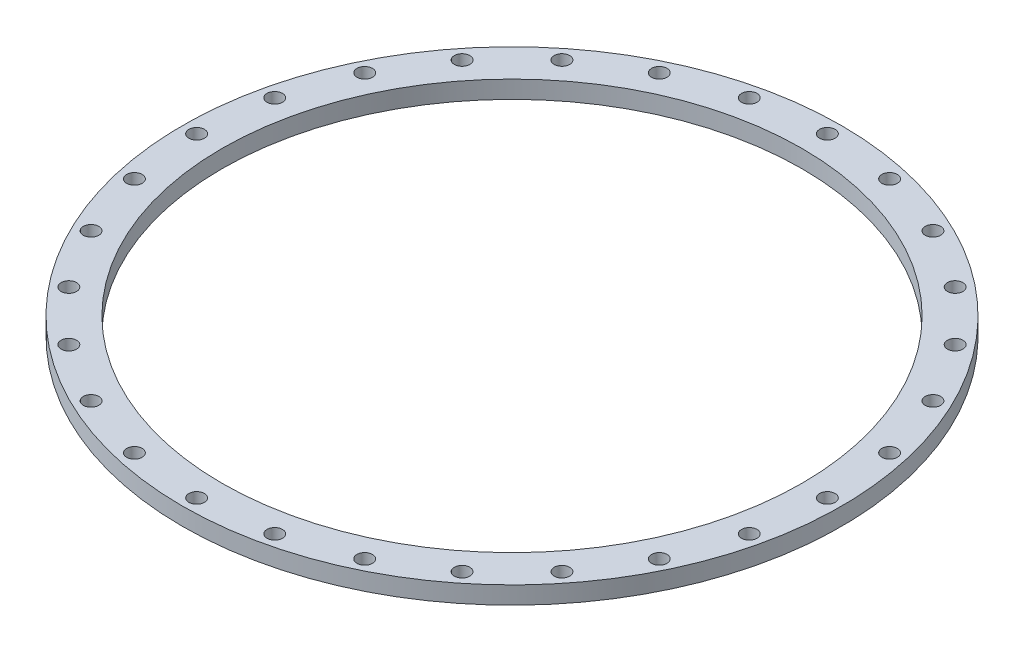
ISO-10303-21;
HEADER;
FILE_DESCRIPTION(('STEP AP214'),'2;1');
FILE_NAME('part.step','',(''),(''),'','','');
FILE_SCHEMA(('AUTOMOTIVE_DESIGN { 1 0 10303 214 1 1 1 1 }'));
ENDSEC;
DATA;
#1=APPLICATION_CONTEXT('core data for automotive mechanical design processes');
#2=APPLICATION_PROTOCOL_DEFINITION('international standard','automotive_design',2000,#1);
#3=PRODUCT_CONTEXT('',#1,'mechanical');
#4=PRODUCT('Part','Part','',(#3));
#5=PRODUCT_RELATED_PRODUCT_CATEGORY('part','',(#4));
#6=PRODUCT_DEFINITION_FORMATION('','',#4);
#7=PRODUCT_DEFINITION_CONTEXT('part definition',#1,'design');
#8=PRODUCT_DEFINITION('design','',#6,#7);
#9=PRODUCT_DEFINITION_SHAPE('','',#8);
#10=(LENGTH_UNIT() NAMED_UNIT(*) SI_UNIT(.MILLI.,.METRE.));
#11=(NAMED_UNIT(*) PLANE_ANGLE_UNIT() SI_UNIT($,.RADIAN.));
#12=(NAMED_UNIT(*) SI_UNIT($,.STERADIAN.) SOLID_ANGLE_UNIT());
#13=UNCERTAINTY_MEASURE_WITH_UNIT(LENGTH_MEASURE(1.E-05),#10,'distance_accuracy_value','');
#14=(GEOMETRIC_REPRESENTATION_CONTEXT(3) GLOBAL_UNCERTAINTY_ASSIGNED_CONTEXT((#13)) GLOBAL_UNIT_ASSIGNED_CONTEXT((#10,
#11,#12)) REPRESENTATION_CONTEXT('',''));
#15=CARTESIAN_POINT('',(0.,0.,0.));
#16=DIRECTION('',(0.,0.,1.));
#17=DIRECTION('',(1.,0.,0.));
#18=AXIS2_PLACEMENT_3D('',#15,#16,#17);
#19=CARTESIAN_POINT('',(0.,-34.,0.));
#20=DIRECTION('',(0.,1.,0.));
#21=DIRECTION('',(0.,0.,1.));
#22=AXIS2_PLACEMENT_3D('',#19,#20,#21);
#23=CYLINDRICAL_SURFACE('',#22,637.5);
#24=CARTESIAN_POINT('',(0.,-34.,0.));
#25=DIRECTION('',(0.,1.,0.));
#26=DIRECTION('',(0.,0.,1.));
#27=AXIS2_PLACEMENT_3D('',#24,#25,#26);
#28=CIRCLE('',#27,637.5);
#29=CARTESIAN_POINT('',(0.,-34.,637.5));
#30=VERTEX_POINT('',#29);
#31=EDGE_CURVE('E10',#30,#30,#28,.T.);
#32=ORIENTED_EDGE('',*,*,#31,.T.);
#33=EDGE_LOOP('',(#32));
#34=FACE_BOUND('',#33,.T.);
#35=CARTESIAN_POINT('',(0.,0.,0.));
#36=DIRECTION('',(0.,1.,0.));
#37=DIRECTION('',(0.,0.,1.));
#38=AXIS2_PLACEMENT_3D('',#35,#36,#37);
#39=CIRCLE('',#38,637.5);
#40=CARTESIAN_POINT('',(0.,0.,637.5));
#41=VERTEX_POINT('',#40);
#42=EDGE_CURVE('E35',#41,#41,#39,.T.);
#43=ORIENTED_EDGE('',*,*,#42,.F.);
#44=EDGE_LOOP('',(#43));
#45=FACE_BOUND('',#44,.T.);
#46=ADVANCED_FACE('F32',(#34,#45),#23,.T.);
#47=CARTESIAN_POINT('',(0.,-34.,0.));
#48=DIRECTION('',(0.,1.,0.));
#49=DIRECTION('',(0.,0.,1.));
#50=AXIS2_PLACEMENT_3D('',#47,#48,#49);
#51=PLANE('',#50);
#52=CARTESIAN_POINT('',(-135.737769713352,-34.,-594.706026430912));
#53=DIRECTION('',(0.,1.,0.));
#54=DIRECTION('',(0.,0.,1.));
#55=AXIS2_PLACEMENT_3D('',#52,#53,#54);
#56=CIRCLE('',#55,15.);
#57=CARTESIAN_POINT('',(-135.737769713352,-34.,-579.706026430912));
#58=VERTEX_POINT('',#57);
#59=EDGE_CURVE('E209',#58,#58,#56,.T.);
#60=ORIENTED_EDGE('',*,*,#59,.T.);
#61=EDGE_LOOP('',(#60));
#62=FACE_BOUND('',#61,.T.);
#63=CARTESIAN_POINT('',(-264.66908086171,-34.,-549.591009420475));
#64=DIRECTION('',(0.,1.,0.));
#65=DIRECTION('',(0.,0.,1.));
#66=AXIS2_PLACEMENT_3D('',#63,#64,#65);
#67=CIRCLE('',#66,15.);
#68=CARTESIAN_POINT('',(-264.66908086171,-34.,-534.591009420475));
#69=VERTEX_POINT('',#68);
#70=EDGE_CURVE('E203',#69,#69,#67,.T.);
#71=ORIENTED_EDGE('',*,*,#70,.T.);
#72=EDGE_LOOP('',(#71));
#73=FACE_BOUND('',#72,.T.);
#74=CARTESIAN_POINT('',(-380.328779133827,-34.,-476.917204305498));
#75=DIRECTION('',(0.,1.,0.));
#76=DIRECTION('',(0.,0.,1.));
#77=AXIS2_PLACEMENT_3D('',#74,#75,#76);
#78=CIRCLE('',#77,15.);
#79=CARTESIAN_POINT('',(-380.328779133827,-34.,-461.917204305498));
#80=VERTEX_POINT('',#79);
#81=EDGE_CURVE('E197',#80,#80,#78,.T.);
#82=ORIENTED_EDGE('',*,*,#81,.T.);
#83=EDGE_LOOP('',(#82));
#84=FACE_BOUND('',#83,.T.);
#85=CARTESIAN_POINT('',(-476.917204305498,-34.,-380.328779133827));
#86=DIRECTION('',(0.,1.,0.));
#87=DIRECTION('',(0.,0.,1.));
#88=AXIS2_PLACEMENT_3D('',#85,#86,#87);
#89=CIRCLE('',#88,15.);
#90=CARTESIAN_POINT('',(-476.917204305498,-34.,-365.328779133827));
#91=VERTEX_POINT('',#90);
#92=EDGE_CURVE('E191',#91,#91,#89,.T.);
#93=ORIENTED_EDGE('',*,*,#92,.T.);
#94=EDGE_LOOP('',(#93));
#95=FACE_BOUND('',#94,.T.);
#96=CARTESIAN_POINT('',(-549.591009420475,-34.,-264.66908086171));
#97=DIRECTION('',(0.,1.,0.));
#98=DIRECTION('',(0.,0.,1.));
#99=AXIS2_PLACEMENT_3D('',#96,#97,#98);
#100=CIRCLE('',#99,15.);
#101=CARTESIAN_POINT('',(-549.591009420475,-34.,-249.66908086171));
#102=VERTEX_POINT('',#101);
#103=EDGE_CURVE('E185',#102,#102,#100,.T.);
#104=ORIENTED_EDGE('',*,*,#103,.T.);
#105=EDGE_LOOP('',(#104));
#106=FACE_BOUND('',#105,.T.);
#107=CARTESIAN_POINT('',(-594.706026430912,-34.,-135.737769713351));
#108=DIRECTION('',(0.,1.,0.));
#109=DIRECTION('',(0.,0.,1.));
#110=AXIS2_PLACEMENT_3D('',#107,#108,#109);
#111=CIRCLE('',#110,15.);
#112=CARTESIAN_POINT('',(-594.706026430912,-34.,-120.737769713351));
#113=VERTEX_POINT('',#112);
#114=EDGE_CURVE('E179',#113,#113,#111,.T.);
#115=ORIENTED_EDGE('',*,*,#114,.T.);
#116=EDGE_LOOP('',(#115));
#117=FACE_BOUND('',#116,.T.);
#118=CARTESIAN_POINT('',(-609.999999999999,-34.,7.07767178198537E-13));
#119=DIRECTION('',(0.,1.,0.));
#120=DIRECTION('',(0.,0.,1.));
#121=AXIS2_PLACEMENT_3D('',#118,#119,#120);
#122=CIRCLE('',#121,15.);
#123=CARTESIAN_POINT('',(-609.999999999999,-34.,15.0000000000007));
#124=VERTEX_POINT('',#123);
#125=EDGE_CURVE('E173',#124,#124,#122,.T.);
#126=ORIENTED_EDGE('',*,*,#125,.T.);
#127=EDGE_LOOP('',(#126));
#128=FACE_BOUND('',#127,.T.);
#129=CARTESIAN_POINT('',(-594.706026430911,-34.,135.737769713352));
#130=DIRECTION('',(0.,1.,0.));
#131=DIRECTION('',(0.,0.,1.));
#132=AXIS2_PLACEMENT_3D('',#129,#130,#131);
#133=CIRCLE('',#132,15.);
#134=CARTESIAN_POINT('',(-594.706026430911,-34.,150.737769713352));
#135=VERTEX_POINT('',#134);
#136=EDGE_CURVE('E167',#135,#135,#133,.T.);
#137=ORIENTED_EDGE('',*,*,#136,.T.);
#138=EDGE_LOOP('',(#137));
#139=FACE_BOUND('',#138,.T.);
#140=CARTESIAN_POINT('',(-549.591009420475,-34.,264.669080861711));
#141=DIRECTION('',(0.,1.,0.));
#142=DIRECTION('',(0.,0.,1.));
#143=AXIS2_PLACEMENT_3D('',#140,#141,#142);
#144=CIRCLE('',#143,15.);
#145=CARTESIAN_POINT('',(-549.591009420475,-34.,279.669080861711));
#146=VERTEX_POINT('',#145);
#147=EDGE_CURVE('E161',#146,#146,#144,.T.);
#148=ORIENTED_EDGE('',*,*,#147,.T.);
#149=EDGE_LOOP('',(#148));
#150=FACE_BOUND('',#149,.T.);
#151=CARTESIAN_POINT('',(-476.917204305497,-34.,380.328779133828));
#152=DIRECTION('',(0.,1.,0.));
#153=DIRECTION('',(0.,0.,1.));
#154=AXIS2_PLACEMENT_3D('',#151,#152,#153);
#155=CIRCLE('',#154,15.);
#156=CARTESIAN_POINT('',(-476.917204305497,-34.,395.328779133828));
#157=VERTEX_POINT('',#156);
#158=EDGE_CURVE('E155',#157,#157,#155,.T.);
#159=ORIENTED_EDGE('',*,*,#158,.T.);
#160=EDGE_LOOP('',(#159));
#161=FACE_BOUND('',#160,.T.);
#162=CARTESIAN_POINT('',(-380.328779133826,-34.,476.917204305499));
#163=DIRECTION('',(0.,1.,0.));
#164=DIRECTION('',(0.,0.,1.));
#165=AXIS2_PLACEMENT_3D('',#162,#163,#164);
#166=CIRCLE('',#165,15.);
#167=CARTESIAN_POINT('',(-380.328779133826,-34.,491.917204305499));
#168=VERTEX_POINT('',#167);
#169=EDGE_CURVE('E149',#168,#168,#166,.T.);
#170=ORIENTED_EDGE('',*,*,#169,.T.);
#171=EDGE_LOOP('',(#170));
#172=FACE_BOUND('',#171,.T.);
#173=CARTESIAN_POINT('',(-264.669080861709,-34.,549.591009420476));
#174=DIRECTION('',(0.,1.,0.));
#175=DIRECTION('',(0.,0.,1.));
#176=AXIS2_PLACEMENT_3D('',#173,#174,#175);
#177=CIRCLE('',#176,15.);
#178=CARTESIAN_POINT('',(-264.669080861709,-34.,564.591009420476));
#179=VERTEX_POINT('',#178);
#180=EDGE_CURVE('E143',#179,#179,#177,.T.);
#181=ORIENTED_EDGE('',*,*,#180,.T.);
#182=EDGE_LOOP('',(#181));
#183=FACE_BOUND('',#182,.T.);
#184=CARTESIAN_POINT('',(-135.73776971335,-34.,594.706026430912));
#185=DIRECTION('',(0.,1.,0.));
#186=DIRECTION('',(0.,0.,1.));
#187=AXIS2_PLACEMENT_3D('',#184,#185,#186);
#188=CIRCLE('',#187,15.);
#189=CARTESIAN_POINT('',(-135.73776971335,-34.,609.706026430912));
#190=VERTEX_POINT('',#189);
#191=EDGE_CURVE('E137',#190,#190,#188,.T.);
#192=ORIENTED_EDGE('',*,*,#191,.T.);
#193=EDGE_LOOP('',(#192));
#194=FACE_BOUND('',#193,.T.);
#195=CARTESIAN_POINT('',(1.4137996329211E-12,-34.,610.));
#196=DIRECTION('',(0.,1.,0.));
#197=DIRECTION('',(0.,0.,1.));
#198=AXIS2_PLACEMENT_3D('',#195,#196,#197);
#199=CIRCLE('',#198,15.);
#200=CARTESIAN_POINT('',(1.4137996329211E-12,-34.,625.));
#201=VERTEX_POINT('',#200);
#202=EDGE_CURVE('E131',#201,#201,#199,.T.);
#203=ORIENTED_EDGE('',*,*,#202,.T.);
#204=EDGE_LOOP('',(#203));
#205=FACE_BOUND('',#204,.T.);
#206=CARTESIAN_POINT('',(135.737769713353,-34.,594.706026430912));
#207=DIRECTION('',(0.,1.,0.));
#208=DIRECTION('',(0.,0.,1.));
#209=AXIS2_PLACEMENT_3D('',#206,#207,#208);
#210=CIRCLE('',#209,15.);
#211=CARTESIAN_POINT('',(135.737769713353,-34.,609.706026430912));
#212=VERTEX_POINT('',#211);
#213=EDGE_CURVE('E125',#212,#212,#210,.T.);
#214=ORIENTED_EDGE('',*,*,#213,.T.);
#215=EDGE_LOOP('',(#214));
#216=FACE_BOUND('',#215,.T.);
#217=CARTESIAN_POINT('',(264.669080861712,-34.,549.591009420475));
#218=DIRECTION('',(0.,1.,0.));
#219=DIRECTION('',(0.,0.,1.));
#220=AXIS2_PLACEMENT_3D('',#217,#218,#219);
#221=CIRCLE('',#220,15.);
#222=CARTESIAN_POINT('',(264.669080861712,-34.,564.591009420475));
#223=VERTEX_POINT('',#222);
#224=EDGE_CURVE('E119',#223,#223,#221,.T.);
#225=ORIENTED_EDGE('',*,*,#224,.T.);
#226=EDGE_LOOP('',(#225));
#227=FACE_BOUND('',#226,.T.);
#228=CARTESIAN_POINT('',(380.328779133829,-34.,476.917204305498));
#229=DIRECTION('',(0.,1.,0.));
#230=DIRECTION('',(0.,0.,1.));
#231=AXIS2_PLACEMENT_3D('',#228,#229,#230);
#232=CIRCLE('',#231,15.);
#233=CARTESIAN_POINT('',(380.328779133829,-34.,491.917204305498));
#234=VERTEX_POINT('',#233);
#235=EDGE_CURVE('E113',#234,#234,#232,.T.);
#236=ORIENTED_EDGE('',*,*,#235,.T.);
#237=EDGE_LOOP('',(#236));
#238=FACE_BOUND('',#237,.T.);
#239=CARTESIAN_POINT('',(476.917204305499,-34.,380.328779133827));
#240=DIRECTION('',(0.,1.,0.));
#241=DIRECTION('',(0.,0.,1.));
#242=AXIS2_PLACEMENT_3D('',#239,#240,#241);
#243=CIRCLE('',#242,15.);
#244=CARTESIAN_POINT('',(476.917204305499,-34.,395.328779133827));
#245=VERTEX_POINT('',#244);
#246=EDGE_CURVE('E107',#245,#245,#243,.T.);
#247=ORIENTED_EDGE('',*,*,#246,.T.);
#248=EDGE_LOOP('',(#247));
#249=FACE_BOUND('',#248,.T.);
#250=CARTESIAN_POINT('',(549.591009420477,-34.,264.66908086171));
#251=DIRECTION('',(0.,1.,0.));
#252=DIRECTION('',(0.,0.,1.));
#253=AXIS2_PLACEMENT_3D('',#250,#251,#252);
#254=CIRCLE('',#253,15.);
#255=CARTESIAN_POINT('',(549.591009420477,-34.,279.66908086171));
#256=VERTEX_POINT('',#255);
#257=EDGE_CURVE('E101',#256,#256,#254,.T.);
#258=ORIENTED_EDGE('',*,*,#257,.T.);
#259=EDGE_LOOP('',(#258));
#260=FACE_BOUND('',#259,.T.);
#261=CARTESIAN_POINT('',(594.706026430913,-34.,135.737769713351));
#262=DIRECTION('',(0.,1.,0.));
#263=DIRECTION('',(0.,0.,1.));
#264=AXIS2_PLACEMENT_3D('',#261,#262,#263);
#265=CIRCLE('',#264,15.);
#266=CARTESIAN_POINT('',(594.706026430913,-34.,150.737769713351));
#267=VERTEX_POINT('',#266);
#268=EDGE_CURVE('E95',#267,#267,#265,.T.);
#269=ORIENTED_EDGE('',*,*,#268,.T.);
#270=EDGE_LOOP('',(#269));
#271=FACE_BOUND('',#270,.T.);
#272=CARTESIAN_POINT('',(610.000000000001,-34.,-7.7715611723761E-13));
#273=DIRECTION('',(0.,1.,0.));
#274=DIRECTION('',(0.,0.,1.));
#275=AXIS2_PLACEMENT_3D('',#272,#273,#274);
#276=CIRCLE('',#275,15.);
#277=CARTESIAN_POINT('',(610.000000000001,-34.,14.9999999999992));
#278=VERTEX_POINT('',#277);
#279=EDGE_CURVE('E89',#278,#278,#276,.T.);
#280=ORIENTED_EDGE('',*,*,#279,.T.);
#281=EDGE_LOOP('',(#280));
#282=FACE_BOUND('',#281,.T.);
#283=CARTESIAN_POINT('',(594.706026430913,-34.,-135.737769713352));
#284=DIRECTION('',(0.,1.,0.));
#285=DIRECTION('',(0.,0.,1.));
#286=AXIS2_PLACEMENT_3D('',#283,#284,#285);
#287=CIRCLE('',#286,15.);
#288=CARTESIAN_POINT('',(594.706026430913,-34.,-120.737769713352));
#289=VERTEX_POINT('',#288);
#290=EDGE_CURVE('E83',#289,#289,#287,.T.);
#291=ORIENTED_EDGE('',*,*,#290,.T.);
#292=EDGE_LOOP('',(#291));
#293=FACE_BOUND('',#292,.T.);
#294=CARTESIAN_POINT('',(549.591009420476,-34.,-264.669080861711));
#295=DIRECTION('',(0.,1.,0.));
#296=DIRECTION('',(0.,0.,1.));
#297=AXIS2_PLACEMENT_3D('',#294,#295,#296);
#298=CIRCLE('',#297,15.);
#299=CARTESIAN_POINT('',(549.591009420476,-34.,-249.669080861711));
#300=VERTEX_POINT('',#299);
#301=EDGE_CURVE('E77',#300,#300,#298,.T.);
#302=ORIENTED_EDGE('',*,*,#301,.T.);
#303=EDGE_LOOP('',(#302));
#304=FACE_BOUND('',#303,.T.);
#305=CARTESIAN_POINT('',(476.917204305498,-34.,-380.328779133828));
#306=DIRECTION('',(0.,1.,0.));
#307=DIRECTION('',(0.,0.,1.));
#308=AXIS2_PLACEMENT_3D('',#305,#306,#307);
#309=CIRCLE('',#308,15.);
#310=CARTESIAN_POINT('',(476.917204305498,-34.,-365.328779133828));
#311=VERTEX_POINT('',#310);
#312=EDGE_CURVE('E71',#311,#311,#309,.T.);
#313=ORIENTED_EDGE('',*,*,#312,.T.);
#314=EDGE_LOOP('',(#313));
#315=FACE_BOUND('',#314,.T.);
#316=CARTESIAN_POINT('',(380.328779133828,-34.,-476.917204305499));
#317=DIRECTION('',(0.,1.,0.));
#318=DIRECTION('',(0.,0.,1.));
#319=AXIS2_PLACEMENT_3D('',#316,#317,#318);
#320=CIRCLE('',#319,15.);
#321=CARTESIAN_POINT('',(380.328779133828,-34.,-461.917204305499));
#322=VERTEX_POINT('',#321);
#323=EDGE_CURVE('E65',#322,#322,#320,.T.);
#324=ORIENTED_EDGE('',*,*,#323,.T.);
#325=EDGE_LOOP('',(#324));
#326=FACE_BOUND('',#325,.T.);
#327=CARTESIAN_POINT('',(264.66908086171,-34.,-549.591009420476));
#328=DIRECTION('',(0.,1.,0.));
#329=DIRECTION('',(0.,0.,1.));
#330=AXIS2_PLACEMENT_3D('',#327,#328,#329);
#331=CIRCLE('',#330,15.);
#332=CARTESIAN_POINT('',(264.66908086171,-34.,-534.591009420476));
#333=VERTEX_POINT('',#332);
#334=EDGE_CURVE('E59',#333,#333,#331,.T.);
#335=ORIENTED_EDGE('',*,*,#334,.T.);
#336=EDGE_LOOP('',(#335));
#337=FACE_BOUND('',#336,.T.);
#338=CARTESIAN_POINT('',(135.737769713352,-34.,-594.706026430913));
#339=DIRECTION('',(0.,1.,0.));
#340=DIRECTION('',(0.,0.,1.));
#341=AXIS2_PLACEMENT_3D('',#338,#339,#340);
#342=CIRCLE('',#341,15.);
#343=CARTESIAN_POINT('',(135.737769713352,-34.,-579.706026430913));
#344=VERTEX_POINT('',#343);
#345=EDGE_CURVE('E53',#344,#344,#342,.T.);
#346=ORIENTED_EDGE('',*,*,#345,.T.);
#347=EDGE_LOOP('',(#346));
#348=FACE_BOUND('',#347,.T.);
#349=CARTESIAN_POINT('',(0.,-34.,-610.));
#350=DIRECTION('',(0.,1.,0.));
#351=DIRECTION('',(0.,0.,1.));
#352=AXIS2_PLACEMENT_3D('',#349,#350,#351);
#353=CIRCLE('',#352,15.);
#354=CARTESIAN_POINT('',(0.,-34.,-595.));
#355=VERTEX_POINT('',#354);
#356=EDGE_CURVE('E47',#355,#355,#353,.T.);
#357=ORIENTED_EDGE('',*,*,#356,.T.);
#358=EDGE_LOOP('',(#357));
#359=FACE_BOUND('',#358,.T.);
#360=CARTESIAN_POINT('',(0.,-34.,0.));
#361=DIRECTION('',(0.,1.,0.));
#362=DIRECTION('',(0.,0.,1.));
#363=AXIS2_PLACEMENT_3D('',#360,#361,#362);
#364=CIRCLE('',#363,561.);
#365=CARTESIAN_POINT('',(0.,-34.,561.));
#366=VERTEX_POINT('',#365);
#367=EDGE_CURVE('E42',#366,#366,#364,.T.);
#368=ORIENTED_EDGE('',*,*,#367,.T.);
#369=EDGE_LOOP('',(#368));
#370=FACE_BOUND('',#369,.T.);
#371=ORIENTED_EDGE('',*,*,#31,.F.);
#372=EDGE_LOOP('',(#371));
#373=FACE_BOUND('',#372,.T.);
#374=ADVANCED_FACE('F218',(#62,#73,#84,#95,#106,#117,#128,#139,#150,#161,#172,#183,#194,#205,
#216,#227,#238,#249,#260,#271,#282,#293,#304,#315,#326,#337,#348,#359,#370,#373),#51,.F.);
#375=CARTESIAN_POINT('',(0.,0.,0.));
#376=DIRECTION('',(0.,1.,0.));
#377=DIRECTION('',(0.,0.,1.));
#378=AXIS2_PLACEMENT_3D('',#375,#376,#377);
#379=PLANE('',#378);
#380=CARTESIAN_POINT('',(-135.737769713352,0.,-594.706026430912));
#381=DIRECTION('',(0.,1.,0.));
#382=DIRECTION('',(0.,0.,1.));
#383=AXIS2_PLACEMENT_3D('',#380,#381,#382);
#384=CIRCLE('',#383,15.);
#385=CARTESIAN_POINT('',(-135.737769713352,0.,-579.706026430912));
#386=VERTEX_POINT('',#385);
#387=EDGE_CURVE('E212',#386,#386,#384,.T.);
#388=ORIENTED_EDGE('',*,*,#387,.F.);
#389=EDGE_LOOP('',(#388));
#390=FACE_BOUND('',#389,.T.);
#391=CARTESIAN_POINT('',(-264.66908086171,0.,-549.591009420475));
#392=DIRECTION('',(0.,1.,0.));
#393=DIRECTION('',(0.,0.,1.));
#394=AXIS2_PLACEMENT_3D('',#391,#392,#393);
#395=CIRCLE('',#394,15.);
#396=CARTESIAN_POINT('',(-264.66908086171,0.,-534.591009420475));
#397=VERTEX_POINT('',#396);
#398=EDGE_CURVE('E206',#397,#397,#395,.T.);
#399=ORIENTED_EDGE('',*,*,#398,.F.);
#400=EDGE_LOOP('',(#399));
#401=FACE_BOUND('',#400,.T.);
#402=CARTESIAN_POINT('',(-380.328779133827,0.,-476.917204305498));
#403=DIRECTION('',(0.,1.,0.));
#404=DIRECTION('',(0.,0.,1.));
#405=AXIS2_PLACEMENT_3D('',#402,#403,#404);
#406=CIRCLE('',#405,15.);
#407=CARTESIAN_POINT('',(-380.328779133827,0.,-461.917204305498));
#408=VERTEX_POINT('',#407);
#409=EDGE_CURVE('E200',#408,#408,#406,.T.);
#410=ORIENTED_EDGE('',*,*,#409,.F.);
#411=EDGE_LOOP('',(#410));
#412=FACE_BOUND('',#411,.T.);
#413=CARTESIAN_POINT('',(-476.917204305498,0.,-380.328779133827));
#414=DIRECTION('',(0.,1.,0.));
#415=DIRECTION('',(0.,0.,1.));
#416=AXIS2_PLACEMENT_3D('',#413,#414,#415);
#417=CIRCLE('',#416,15.);
#418=CARTESIAN_POINT('',(-476.917204305498,0.,-365.328779133827));
#419=VERTEX_POINT('',#418);
#420=EDGE_CURVE('E194',#419,#419,#417,.T.);
#421=ORIENTED_EDGE('',*,*,#420,.F.);
#422=EDGE_LOOP('',(#421));
#423=FACE_BOUND('',#422,.T.);
#424=CARTESIAN_POINT('',(-549.591009420475,0.,-264.66908086171));
#425=DIRECTION('',(0.,1.,0.));
#426=DIRECTION('',(0.,0.,1.));
#427=AXIS2_PLACEMENT_3D('',#424,#425,#426);
#428=CIRCLE('',#427,15.);
#429=CARTESIAN_POINT('',(-549.591009420475,0.,-249.66908086171));
#430=VERTEX_POINT('',#429);
#431=EDGE_CURVE('E188',#430,#430,#428,.T.);
#432=ORIENTED_EDGE('',*,*,#431,.F.);
#433=EDGE_LOOP('',(#432));
#434=FACE_BOUND('',#433,.T.);
#435=CARTESIAN_POINT('',(-594.706026430912,0.,-135.737769713351));
#436=DIRECTION('',(0.,1.,0.));
#437=DIRECTION('',(0.,0.,1.));
#438=AXIS2_PLACEMENT_3D('',#435,#436,#437);
#439=CIRCLE('',#438,15.);
#440=CARTESIAN_POINT('',(-594.706026430912,0.,-120.737769713351));
#441=VERTEX_POINT('',#440);
#442=EDGE_CURVE('E182',#441,#441,#439,.T.);
#443=ORIENTED_EDGE('',*,*,#442,.F.);
#444=EDGE_LOOP('',(#443));
#445=FACE_BOUND('',#444,.T.);
#446=CARTESIAN_POINT('',(-609.999999999999,0.,7.07767178198537E-13));
#447=DIRECTION('',(0.,1.,0.));
#448=DIRECTION('',(0.,0.,1.));
#449=AXIS2_PLACEMENT_3D('',#446,#447,#448);
#450=CIRCLE('',#449,15.);
#451=CARTESIAN_POINT('',(-609.999999999999,0.,15.0000000000007));
#452=VERTEX_POINT('',#451);
#453=EDGE_CURVE('E176',#452,#452,#450,.T.);
#454=ORIENTED_EDGE('',*,*,#453,.F.);
#455=EDGE_LOOP('',(#454));
#456=FACE_BOUND('',#455,.T.);
#457=CARTESIAN_POINT('',(-594.706026430911,0.,135.737769713352));
#458=DIRECTION('',(0.,1.,0.));
#459=DIRECTION('',(0.,0.,1.));
#460=AXIS2_PLACEMENT_3D('',#457,#458,#459);
#461=CIRCLE('',#460,15.);
#462=CARTESIAN_POINT('',(-594.706026430911,0.,150.737769713352));
#463=VERTEX_POINT('',#462);
#464=EDGE_CURVE('E170',#463,#463,#461,.T.);
#465=ORIENTED_EDGE('',*,*,#464,.F.);
#466=EDGE_LOOP('',(#465));
#467=FACE_BOUND('',#466,.T.);
#468=CARTESIAN_POINT('',(-549.591009420475,0.,264.669080861711));
#469=DIRECTION('',(0.,1.,0.));
#470=DIRECTION('',(0.,0.,1.));
#471=AXIS2_PLACEMENT_3D('',#468,#469,#470);
#472=CIRCLE('',#471,15.);
#473=CARTESIAN_POINT('',(-549.591009420475,0.,279.669080861711));
#474=VERTEX_POINT('',#473);
#475=EDGE_CURVE('E164',#474,#474,#472,.T.);
#476=ORIENTED_EDGE('',*,*,#475,.F.);
#477=EDGE_LOOP('',(#476));
#478=FACE_BOUND('',#477,.T.);
#479=CARTESIAN_POINT('',(-476.917204305497,0.,380.328779133828));
#480=DIRECTION('',(0.,1.,0.));
#481=DIRECTION('',(0.,0.,1.));
#482=AXIS2_PLACEMENT_3D('',#479,#480,#481);
#483=CIRCLE('',#482,15.);
#484=CARTESIAN_POINT('',(-476.917204305497,0.,395.328779133828));
#485=VERTEX_POINT('',#484);
#486=EDGE_CURVE('E158',#485,#485,#483,.T.);
#487=ORIENTED_EDGE('',*,*,#486,.F.);
#488=EDGE_LOOP('',(#487));
#489=FACE_BOUND('',#488,.T.);
#490=CARTESIAN_POINT('',(-380.328779133826,0.,476.917204305499));
#491=DIRECTION('',(0.,1.,0.));
#492=DIRECTION('',(0.,0.,1.));
#493=AXIS2_PLACEMENT_3D('',#490,#491,#492);
#494=CIRCLE('',#493,15.);
#495=CARTESIAN_POINT('',(-380.328779133826,0.,491.917204305499));
#496=VERTEX_POINT('',#495);
#497=EDGE_CURVE('E152',#496,#496,#494,.T.);
#498=ORIENTED_EDGE('',*,*,#497,.F.);
#499=EDGE_LOOP('',(#498));
#500=FACE_BOUND('',#499,.T.);
#501=CARTESIAN_POINT('',(-264.669080861709,0.,549.591009420476));
#502=DIRECTION('',(0.,1.,0.));
#503=DIRECTION('',(0.,0.,1.));
#504=AXIS2_PLACEMENT_3D('',#501,#502,#503);
#505=CIRCLE('',#504,15.);
#506=CARTESIAN_POINT('',(-264.669080861709,0.,564.591009420476));
#507=VERTEX_POINT('',#506);
#508=EDGE_CURVE('E146',#507,#507,#505,.T.);
#509=ORIENTED_EDGE('',*,*,#508,.F.);
#510=EDGE_LOOP('',(#509));
#511=FACE_BOUND('',#510,.T.);
#512=CARTESIAN_POINT('',(-135.73776971335,0.,594.706026430912));
#513=DIRECTION('',(0.,1.,0.));
#514=DIRECTION('',(0.,0.,1.));
#515=AXIS2_PLACEMENT_3D('',#512,#513,#514);
#516=CIRCLE('',#515,15.);
#517=CARTESIAN_POINT('',(-135.73776971335,0.,609.706026430912));
#518=VERTEX_POINT('',#517);
#519=EDGE_CURVE('E140',#518,#518,#516,.T.);
#520=ORIENTED_EDGE('',*,*,#519,.F.);
#521=EDGE_LOOP('',(#520));
#522=FACE_BOUND('',#521,.T.);
#523=CARTESIAN_POINT('',(1.4137996329211E-12,0.,610.));
#524=DIRECTION('',(0.,1.,0.));
#525=DIRECTION('',(0.,0.,1.));
#526=AXIS2_PLACEMENT_3D('',#523,#524,#525);
#527=CIRCLE('',#526,15.);
#528=CARTESIAN_POINT('',(1.4137996329211E-12,0.,625.));
#529=VERTEX_POINT('',#528);
#530=EDGE_CURVE('E134',#529,#529,#527,.T.);
#531=ORIENTED_EDGE('',*,*,#530,.F.);
#532=EDGE_LOOP('',(#531));
#533=FACE_BOUND('',#532,.T.);
#534=CARTESIAN_POINT('',(135.737769713353,0.,594.706026430912));
#535=DIRECTION('',(0.,1.,0.));
#536=DIRECTION('',(0.,0.,1.));
#537=AXIS2_PLACEMENT_3D('',#534,#535,#536);
#538=CIRCLE('',#537,15.);
#539=CARTESIAN_POINT('',(135.737769713353,0.,609.706026430912));
#540=VERTEX_POINT('',#539);
#541=EDGE_CURVE('E128',#540,#540,#538,.T.);
#542=ORIENTED_EDGE('',*,*,#541,.F.);
#543=EDGE_LOOP('',(#542));
#544=FACE_BOUND('',#543,.T.);
#545=CARTESIAN_POINT('',(264.669080861712,0.,549.591009420475));
#546=DIRECTION('',(0.,1.,0.));
#547=DIRECTION('',(0.,0.,1.));
#548=AXIS2_PLACEMENT_3D('',#545,#546,#547);
#549=CIRCLE('',#548,15.);
#550=CARTESIAN_POINT('',(264.669080861712,0.,564.591009420475));
#551=VERTEX_POINT('',#550);
#552=EDGE_CURVE('E122',#551,#551,#549,.T.);
#553=ORIENTED_EDGE('',*,*,#552,.F.);
#554=EDGE_LOOP('',(#553));
#555=FACE_BOUND('',#554,.T.);
#556=CARTESIAN_POINT('',(380.328779133829,0.,476.917204305498));
#557=DIRECTION('',(0.,1.,0.));
#558=DIRECTION('',(0.,0.,1.));
#559=AXIS2_PLACEMENT_3D('',#556,#557,#558);
#560=CIRCLE('',#559,15.);
#561=CARTESIAN_POINT('',(380.328779133829,0.,491.917204305498));
#562=VERTEX_POINT('',#561);
#563=EDGE_CURVE('E116',#562,#562,#560,.T.);
#564=ORIENTED_EDGE('',*,*,#563,.F.);
#565=EDGE_LOOP('',(#564));
#566=FACE_BOUND('',#565,.T.);
#567=CARTESIAN_POINT('',(476.917204305499,0.,380.328779133827));
#568=DIRECTION('',(0.,1.,0.));
#569=DIRECTION('',(0.,0.,1.));
#570=AXIS2_PLACEMENT_3D('',#567,#568,#569);
#571=CIRCLE('',#570,15.);
#572=CARTESIAN_POINT('',(476.917204305499,0.,395.328779133827));
#573=VERTEX_POINT('',#572);
#574=EDGE_CURVE('E110',#573,#573,#571,.T.);
#575=ORIENTED_EDGE('',*,*,#574,.F.);
#576=EDGE_LOOP('',(#575));
#577=FACE_BOUND('',#576,.T.);
#578=CARTESIAN_POINT('',(549.591009420477,0.,264.66908086171));
#579=DIRECTION('',(0.,1.,0.));
#580=DIRECTION('',(0.,0.,1.));
#581=AXIS2_PLACEMENT_3D('',#578,#579,#580);
#582=CIRCLE('',#581,15.);
#583=CARTESIAN_POINT('',(549.591009420477,0.,279.66908086171));
#584=VERTEX_POINT('',#583);
#585=EDGE_CURVE('E104',#584,#584,#582,.T.);
#586=ORIENTED_EDGE('',*,*,#585,.F.);
#587=EDGE_LOOP('',(#586));
#588=FACE_BOUND('',#587,.T.);
#589=CARTESIAN_POINT('',(594.706026430913,0.,135.737769713351));
#590=DIRECTION('',(0.,1.,0.));
#591=DIRECTION('',(0.,0.,1.));
#592=AXIS2_PLACEMENT_3D('',#589,#590,#591);
#593=CIRCLE('',#592,15.);
#594=CARTESIAN_POINT('',(594.706026430913,0.,150.737769713351));
#595=VERTEX_POINT('',#594);
#596=EDGE_CURVE('E98',#595,#595,#593,.T.);
#597=ORIENTED_EDGE('',*,*,#596,.F.);
#598=EDGE_LOOP('',(#597));
#599=FACE_BOUND('',#598,.T.);
#600=CARTESIAN_POINT('',(610.000000000001,0.,-7.7715611723761E-13));
#601=DIRECTION('',(0.,1.,0.));
#602=DIRECTION('',(0.,0.,1.));
#603=AXIS2_PLACEMENT_3D('',#600,#601,#602);
#604=CIRCLE('',#603,15.);
#605=CARTESIAN_POINT('',(610.000000000001,0.,14.9999999999992));
#606=VERTEX_POINT('',#605);
#607=EDGE_CURVE('E92',#606,#606,#604,.T.);
#608=ORIENTED_EDGE('',*,*,#607,.F.);
#609=EDGE_LOOP('',(#608));
#610=FACE_BOUND('',#609,.T.);
#611=CARTESIAN_POINT('',(594.706026430913,0.,-135.737769713352));
#612=DIRECTION('',(0.,1.,0.));
#613=DIRECTION('',(0.,0.,1.));
#614=AXIS2_PLACEMENT_3D('',#611,#612,#613);
#615=CIRCLE('',#614,15.);
#616=CARTESIAN_POINT('',(594.706026430913,0.,-120.737769713352));
#617=VERTEX_POINT('',#616);
#618=EDGE_CURVE('E86',#617,#617,#615,.T.);
#619=ORIENTED_EDGE('',*,*,#618,.F.);
#620=EDGE_LOOP('',(#619));
#621=FACE_BOUND('',#620,.T.);
#622=CARTESIAN_POINT('',(549.591009420476,0.,-264.669080861711));
#623=DIRECTION('',(0.,1.,0.));
#624=DIRECTION('',(0.,0.,1.));
#625=AXIS2_PLACEMENT_3D('',#622,#623,#624);
#626=CIRCLE('',#625,15.);
#627=CARTESIAN_POINT('',(549.591009420476,0.,-249.669080861711));
#628=VERTEX_POINT('',#627);
#629=EDGE_CURVE('E80',#628,#628,#626,.T.);
#630=ORIENTED_EDGE('',*,*,#629,.F.);
#631=EDGE_LOOP('',(#630));
#632=FACE_BOUND('',#631,.T.);
#633=CARTESIAN_POINT('',(476.917204305498,0.,-380.328779133828));
#634=DIRECTION('',(0.,1.,0.));
#635=DIRECTION('',(0.,0.,1.));
#636=AXIS2_PLACEMENT_3D('',#633,#634,#635);
#637=CIRCLE('',#636,15.);
#638=CARTESIAN_POINT('',(476.917204305498,0.,-365.328779133828));
#639=VERTEX_POINT('',#638);
#640=EDGE_CURVE('E74',#639,#639,#637,.T.);
#641=ORIENTED_EDGE('',*,*,#640,.F.);
#642=EDGE_LOOP('',(#641));
#643=FACE_BOUND('',#642,.T.);
#644=CARTESIAN_POINT('',(380.328779133828,0.,-476.917204305499));
#645=DIRECTION('',(0.,1.,0.));
#646=DIRECTION('',(0.,0.,1.));
#647=AXIS2_PLACEMENT_3D('',#644,#645,#646);
#648=CIRCLE('',#647,15.);
#649=CARTESIAN_POINT('',(380.328779133828,0.,-461.917204305499));
#650=VERTEX_POINT('',#649);
#651=EDGE_CURVE('E68',#650,#650,#648,.T.);
#652=ORIENTED_EDGE('',*,*,#651,.F.);
#653=EDGE_LOOP('',(#652));
#654=FACE_BOUND('',#653,.T.);
#655=CARTESIAN_POINT('',(264.66908086171,0.,-549.591009420476));
#656=DIRECTION('',(0.,1.,0.));
#657=DIRECTION('',(0.,0.,1.));
#658=AXIS2_PLACEMENT_3D('',#655,#656,#657);
#659=CIRCLE('',#658,15.);
#660=CARTESIAN_POINT('',(264.66908086171,0.,-534.591009420476));
#661=VERTEX_POINT('',#660);
#662=EDGE_CURVE('E62',#661,#661,#659,.T.);
#663=ORIENTED_EDGE('',*,*,#662,.F.);
#664=EDGE_LOOP('',(#663));
#665=FACE_BOUND('',#664,.T.);
#666=CARTESIAN_POINT('',(135.737769713352,0.,-594.706026430913));
#667=DIRECTION('',(0.,1.,0.));
#668=DIRECTION('',(0.,0.,1.));
#669=AXIS2_PLACEMENT_3D('',#666,#667,#668);
#670=CIRCLE('',#669,15.);
#671=CARTESIAN_POINT('',(135.737769713352,0.,-579.706026430913));
#672=VERTEX_POINT('',#671);
#673=EDGE_CURVE('E56',#672,#672,#670,.T.);
#674=ORIENTED_EDGE('',*,*,#673,.F.);
#675=EDGE_LOOP('',(#674));
#676=FACE_BOUND('',#675,.T.);
#677=CARTESIAN_POINT('',(0.,0.,-610.));
#678=DIRECTION('',(0.,1.,0.));
#679=DIRECTION('',(0.,0.,1.));
#680=AXIS2_PLACEMENT_3D('',#677,#678,#679);
#681=CIRCLE('',#680,15.);
#682=CARTESIAN_POINT('',(0.,0.,-595.));
#683=VERTEX_POINT('',#682);
#684=EDGE_CURVE('E50',#683,#683,#681,.T.);
#685=ORIENTED_EDGE('',*,*,#684,.F.);
#686=EDGE_LOOP('',(#685));
#687=FACE_BOUND('',#686,.T.);
#688=CARTESIAN_POINT('',(0.,0.,0.));
#689=DIRECTION('',(0.,1.,0.));
#690=DIRECTION('',(0.,0.,1.));
#691=AXIS2_PLACEMENT_3D('',#688,#689,#690);
#692=CIRCLE('',#691,561.);
#693=CARTESIAN_POINT('',(0.,0.,561.));
#694=VERTEX_POINT('',#693);
#695=EDGE_CURVE('E44',#694,#694,#692,.T.);
#696=ORIENTED_EDGE('',*,*,#695,.F.);
#697=EDGE_LOOP('',(#696));
#698=FACE_BOUND('',#697,.T.);
#699=ORIENTED_EDGE('',*,*,#42,.T.);
#700=EDGE_LOOP('',(#699));
#701=FACE_BOUND('',#700,.T.);
#702=ADVANCED_FACE('F228',(#390,#401,#412,#423,#434,#445,#456,#467,#478,#489,#500,#511,#522,
#533,#544,#555,#566,#577,#588,#599,#610,#621,#632,#643,#654,#665,#676,#687,#698,#701),#379,.T.);
#703=CARTESIAN_POINT('',(0.,-34.,0.));
#704=DIRECTION('',(0.,1.,0.));
#705=DIRECTION('',(0.,0.,1.));
#706=AXIS2_PLACEMENT_3D('',#703,#704,#705);
#707=CYLINDRICAL_SURFACE('',#706,561.);
#708=ORIENTED_EDGE('',*,*,#367,.F.);
#709=EDGE_LOOP('',(#708));
#710=FACE_BOUND('',#709,.T.);
#711=ORIENTED_EDGE('',*,*,#695,.T.);
#712=EDGE_LOOP('',(#711));
#713=FACE_BOUND('',#712,.T.);
#714=ADVANCED_FACE('F231',(#710,#713),#707,.F.);
#715=CARTESIAN_POINT('',(0.,-34.,-610.));
#716=DIRECTION('',(0.,1.,0.));
#717=DIRECTION('',(0.,0.,1.));
#718=AXIS2_PLACEMENT_3D('',#715,#716,#717);
#719=CYLINDRICAL_SURFACE('',#718,15.);
#720=ORIENTED_EDGE('',*,*,#356,.F.);
#721=EDGE_LOOP('',(#720));
#722=FACE_BOUND('',#721,.T.);
#723=ORIENTED_EDGE('',*,*,#684,.T.);
#724=EDGE_LOOP('',(#723));
#725=FACE_BOUND('',#724,.T.);
#726=ADVANCED_FACE('F300',(#722,#725),#719,.F.);
#727=CARTESIAN_POINT('',(135.737769713352,-34.,-594.706026430913));
#728=DIRECTION('',(0.,1.,0.));
#729=DIRECTION('',(0.,0.,1.));
#730=AXIS2_PLACEMENT_3D('',#727,#728,#729);
#731=CYLINDRICAL_SURFACE('',#730,15.);
#732=ORIENTED_EDGE('',*,*,#345,.F.);
#733=EDGE_LOOP('',(#732));
#734=FACE_BOUND('',#733,.T.);
#735=ORIENTED_EDGE('',*,*,#673,.T.);
#736=EDGE_LOOP('',(#735));
#737=FACE_BOUND('',#736,.T.);
#738=ADVANCED_FACE('F304',(#734,#737),#731,.F.);
#739=CARTESIAN_POINT('',(264.66908086171,-34.,-549.591009420476));
#740=DIRECTION('',(0.,1.,0.));
#741=DIRECTION('',(0.,0.,1.));
#742=AXIS2_PLACEMENT_3D('',#739,#740,#741);
#743=CYLINDRICAL_SURFACE('',#742,15.);
#744=ORIENTED_EDGE('',*,*,#334,.F.);
#745=EDGE_LOOP('',(#744));
#746=FACE_BOUND('',#745,.T.);
#747=ORIENTED_EDGE('',*,*,#662,.T.);
#748=EDGE_LOOP('',(#747));
#749=FACE_BOUND('',#748,.T.);
#750=ADVANCED_FACE('F308',(#746,#749),#743,.F.);
#751=CARTESIAN_POINT('',(380.328779133828,-34.,-476.917204305499));
#752=DIRECTION('',(0.,1.,0.));
#753=DIRECTION('',(0.,0.,1.));
#754=AXIS2_PLACEMENT_3D('',#751,#752,#753);
#755=CYLINDRICAL_SURFACE('',#754,15.);
#756=ORIENTED_EDGE('',*,*,#323,.F.);
#757=EDGE_LOOP('',(#756));
#758=FACE_BOUND('',#757,.T.);
#759=ORIENTED_EDGE('',*,*,#651,.T.);
#760=EDGE_LOOP('',(#759));
#761=FACE_BOUND('',#760,.T.);
#762=ADVANCED_FACE('F312',(#758,#761),#755,.F.);
#763=CARTESIAN_POINT('',(476.917204305498,-34.,-380.328779133828));
#764=DIRECTION('',(0.,1.,0.));
#765=DIRECTION('',(0.,0.,1.));
#766=AXIS2_PLACEMENT_3D('',#763,#764,#765);
#767=CYLINDRICAL_SURFACE('',#766,15.);
#768=ORIENTED_EDGE('',*,*,#312,.F.);
#769=EDGE_LOOP('',(#768));
#770=FACE_BOUND('',#769,.T.);
#771=ORIENTED_EDGE('',*,*,#640,.T.);
#772=EDGE_LOOP('',(#771));
#773=FACE_BOUND('',#772,.T.);
#774=ADVANCED_FACE('F316',(#770,#773),#767,.F.);
#775=CARTESIAN_POINT('',(549.591009420476,-34.,-264.669080861711));
#776=DIRECTION('',(0.,1.,0.));
#777=DIRECTION('',(0.,0.,1.));
#778=AXIS2_PLACEMENT_3D('',#775,#776,#777);
#779=CYLINDRICAL_SURFACE('',#778,15.);
#780=ORIENTED_EDGE('',*,*,#301,.F.);
#781=EDGE_LOOP('',(#780));
#782=FACE_BOUND('',#781,.T.);
#783=ORIENTED_EDGE('',*,*,#629,.T.);
#784=EDGE_LOOP('',(#783));
#785=FACE_BOUND('',#784,.T.);
#786=ADVANCED_FACE('F320',(#782,#785),#779,.F.);
#787=CARTESIAN_POINT('',(594.706026430913,-34.,-135.737769713352));
#788=DIRECTION('',(0.,1.,0.));
#789=DIRECTION('',(0.,0.,1.));
#790=AXIS2_PLACEMENT_3D('',#787,#788,#789);
#791=CYLINDRICAL_SURFACE('',#790,15.);
#792=ORIENTED_EDGE('',*,*,#290,.F.);
#793=EDGE_LOOP('',(#792));
#794=FACE_BOUND('',#793,.T.);
#795=ORIENTED_EDGE('',*,*,#618,.T.);
#796=EDGE_LOOP('',(#795));
#797=FACE_BOUND('',#796,.T.);
#798=ADVANCED_FACE('F324',(#794,#797),#791,.F.);
#799=CARTESIAN_POINT('',(610.000000000001,-34.,-7.7715611723761E-13));
#800=DIRECTION('',(0.,1.,0.));
#801=DIRECTION('',(0.,0.,1.));
#802=AXIS2_PLACEMENT_3D('',#799,#800,#801);
#803=CYLINDRICAL_SURFACE('',#802,15.);
#804=ORIENTED_EDGE('',*,*,#279,.F.);
#805=EDGE_LOOP('',(#804));
#806=FACE_BOUND('',#805,.T.);
#807=ORIENTED_EDGE('',*,*,#607,.T.);
#808=EDGE_LOOP('',(#807));
#809=FACE_BOUND('',#808,.T.);
#810=ADVANCED_FACE('F328',(#806,#809),#803,.F.);
#811=CARTESIAN_POINT('',(594.706026430913,-34.,135.737769713351));
#812=DIRECTION('',(0.,1.,0.));
#813=DIRECTION('',(0.,0.,1.));
#814=AXIS2_PLACEMENT_3D('',#811,#812,#813);
#815=CYLINDRICAL_SURFACE('',#814,15.);
#816=ORIENTED_EDGE('',*,*,#268,.F.);
#817=EDGE_LOOP('',(#816));
#818=FACE_BOUND('',#817,.T.);
#819=ORIENTED_EDGE('',*,*,#596,.T.);
#820=EDGE_LOOP('',(#819));
#821=FACE_BOUND('',#820,.T.);
#822=ADVANCED_FACE('F332',(#818,#821),#815,.F.);
#823=CARTESIAN_POINT('',(549.591009420477,-34.,264.66908086171));
#824=DIRECTION('',(0.,1.,0.));
#825=DIRECTION('',(0.,0.,1.));
#826=AXIS2_PLACEMENT_3D('',#823,#824,#825);
#827=CYLINDRICAL_SURFACE('',#826,15.);
#828=ORIENTED_EDGE('',*,*,#257,.F.);
#829=EDGE_LOOP('',(#828));
#830=FACE_BOUND('',#829,.T.);
#831=ORIENTED_EDGE('',*,*,#585,.T.);
#832=EDGE_LOOP('',(#831));
#833=FACE_BOUND('',#832,.T.);
#834=ADVANCED_FACE('F336',(#830,#833),#827,.F.);
#835=CARTESIAN_POINT('',(476.917204305499,-34.,380.328779133827));
#836=DIRECTION('',(0.,1.,0.));
#837=DIRECTION('',(0.,0.,1.));
#838=AXIS2_PLACEMENT_3D('',#835,#836,#837);
#839=CYLINDRICAL_SURFACE('',#838,15.);
#840=ORIENTED_EDGE('',*,*,#246,.F.);
#841=EDGE_LOOP('',(#840));
#842=FACE_BOUND('',#841,.T.);
#843=ORIENTED_EDGE('',*,*,#574,.T.);
#844=EDGE_LOOP('',(#843));
#845=FACE_BOUND('',#844,.T.);
#846=ADVANCED_FACE('F340',(#842,#845),#839,.F.);
#847=CARTESIAN_POINT('',(380.328779133829,-34.,476.917204305498));
#848=DIRECTION('',(0.,1.,0.));
#849=DIRECTION('',(0.,0.,1.));
#850=AXIS2_PLACEMENT_3D('',#847,#848,#849);
#851=CYLINDRICAL_SURFACE('',#850,15.);
#852=ORIENTED_EDGE('',*,*,#235,.F.);
#853=EDGE_LOOP('',(#852));
#854=FACE_BOUND('',#853,.T.);
#855=ORIENTED_EDGE('',*,*,#563,.T.);
#856=EDGE_LOOP('',(#855));
#857=FACE_BOUND('',#856,.T.);
#858=ADVANCED_FACE('F344',(#854,#857),#851,.F.);
#859=CARTESIAN_POINT('',(264.669080861712,-34.,549.591009420475));
#860=DIRECTION('',(0.,1.,0.));
#861=DIRECTION('',(0.,0.,1.));
#862=AXIS2_PLACEMENT_3D('',#859,#860,#861);
#863=CYLINDRICAL_SURFACE('',#862,15.);
#864=ORIENTED_EDGE('',*,*,#224,.F.);
#865=EDGE_LOOP('',(#864));
#866=FACE_BOUND('',#865,.T.);
#867=ORIENTED_EDGE('',*,*,#552,.T.);
#868=EDGE_LOOP('',(#867));
#869=FACE_BOUND('',#868,.T.);
#870=ADVANCED_FACE('F348',(#866,#869),#863,.F.);
#871=CARTESIAN_POINT('',(135.737769713353,-34.,594.706026430912));
#872=DIRECTION('',(0.,1.,0.));
#873=DIRECTION('',(0.,0.,1.));
#874=AXIS2_PLACEMENT_3D('',#871,#872,#873);
#875=CYLINDRICAL_SURFACE('',#874,15.);
#876=ORIENTED_EDGE('',*,*,#213,.F.);
#877=EDGE_LOOP('',(#876));
#878=FACE_BOUND('',#877,.T.);
#879=ORIENTED_EDGE('',*,*,#541,.T.);
#880=EDGE_LOOP('',(#879));
#881=FACE_BOUND('',#880,.T.);
#882=ADVANCED_FACE('F352',(#878,#881),#875,.F.);
#883=CARTESIAN_POINT('',(1.4137996329211E-12,-34.,610.));
#884=DIRECTION('',(0.,1.,0.));
#885=DIRECTION('',(0.,0.,1.));
#886=AXIS2_PLACEMENT_3D('',#883,#884,#885);
#887=CYLINDRICAL_SURFACE('',#886,15.);
#888=ORIENTED_EDGE('',*,*,#202,.F.);
#889=EDGE_LOOP('',(#888));
#890=FACE_BOUND('',#889,.T.);
#891=ORIENTED_EDGE('',*,*,#530,.T.);
#892=EDGE_LOOP('',(#891));
#893=FACE_BOUND('',#892,.T.);
#894=ADVANCED_FACE('F356',(#890,#893),#887,.F.);
#895=CARTESIAN_POINT('',(-135.73776971335,-34.,594.706026430912));
#896=DIRECTION('',(0.,1.,0.));
#897=DIRECTION('',(0.,0.,1.));
#898=AXIS2_PLACEMENT_3D('',#895,#896,#897);
#899=CYLINDRICAL_SURFACE('',#898,15.);
#900=ORIENTED_EDGE('',*,*,#191,.F.);
#901=EDGE_LOOP('',(#900));
#902=FACE_BOUND('',#901,.T.);
#903=ORIENTED_EDGE('',*,*,#519,.T.);
#904=EDGE_LOOP('',(#903));
#905=FACE_BOUND('',#904,.T.);
#906=ADVANCED_FACE('F360',(#902,#905),#899,.F.);
#907=CARTESIAN_POINT('',(-264.669080861709,-34.,549.591009420476));
#908=DIRECTION('',(0.,1.,0.));
#909=DIRECTION('',(0.,0.,1.));
#910=AXIS2_PLACEMENT_3D('',#907,#908,#909);
#911=CYLINDRICAL_SURFACE('',#910,15.);
#912=ORIENTED_EDGE('',*,*,#180,.F.);
#913=EDGE_LOOP('',(#912));
#914=FACE_BOUND('',#913,.T.);
#915=ORIENTED_EDGE('',*,*,#508,.T.);
#916=EDGE_LOOP('',(#915));
#917=FACE_BOUND('',#916,.T.);
#918=ADVANCED_FACE('F364',(#914,#917),#911,.F.);
#919=CARTESIAN_POINT('',(-380.328779133826,-34.,476.917204305499));
#920=DIRECTION('',(0.,1.,0.));
#921=DIRECTION('',(0.,0.,1.));
#922=AXIS2_PLACEMENT_3D('',#919,#920,#921);
#923=CYLINDRICAL_SURFACE('',#922,15.);
#924=ORIENTED_EDGE('',*,*,#169,.F.);
#925=EDGE_LOOP('',(#924));
#926=FACE_BOUND('',#925,.T.);
#927=ORIENTED_EDGE('',*,*,#497,.T.);
#928=EDGE_LOOP('',(#927));
#929=FACE_BOUND('',#928,.T.);
#930=ADVANCED_FACE('F368',(#926,#929),#923,.F.);
#931=CARTESIAN_POINT('',(-476.917204305497,-34.,380.328779133828));
#932=DIRECTION('',(0.,1.,0.));
#933=DIRECTION('',(0.,0.,1.));
#934=AXIS2_PLACEMENT_3D('',#931,#932,#933);
#935=CYLINDRICAL_SURFACE('',#934,15.);
#936=ORIENTED_EDGE('',*,*,#158,.F.);
#937=EDGE_LOOP('',(#936));
#938=FACE_BOUND('',#937,.T.);
#939=ORIENTED_EDGE('',*,*,#486,.T.);
#940=EDGE_LOOP('',(#939));
#941=FACE_BOUND('',#940,.T.);
#942=ADVANCED_FACE('F372',(#938,#941),#935,.F.);
#943=CARTESIAN_POINT('',(-549.591009420475,-34.,264.669080861711));
#944=DIRECTION('',(0.,1.,0.));
#945=DIRECTION('',(0.,0.,1.));
#946=AXIS2_PLACEMENT_3D('',#943,#944,#945);
#947=CYLINDRICAL_SURFACE('',#946,15.);
#948=ORIENTED_EDGE('',*,*,#147,.F.);
#949=EDGE_LOOP('',(#948));
#950=FACE_BOUND('',#949,.T.);
#951=ORIENTED_EDGE('',*,*,#475,.T.);
#952=EDGE_LOOP('',(#951));
#953=FACE_BOUND('',#952,.T.);
#954=ADVANCED_FACE('F376',(#950,#953),#947,.F.);
#955=CARTESIAN_POINT('',(-594.706026430911,-34.,135.737769713352));
#956=DIRECTION('',(0.,1.,0.));
#957=DIRECTION('',(0.,0.,1.));
#958=AXIS2_PLACEMENT_3D('',#955,#956,#957);
#959=CYLINDRICAL_SURFACE('',#958,15.);
#960=ORIENTED_EDGE('',*,*,#136,.F.);
#961=EDGE_LOOP('',(#960));
#962=FACE_BOUND('',#961,.T.);
#963=ORIENTED_EDGE('',*,*,#464,.T.);
#964=EDGE_LOOP('',(#963));
#965=FACE_BOUND('',#964,.T.);
#966=ADVANCED_FACE('F380',(#962,#965),#959,.F.);
#967=CARTESIAN_POINT('',(-609.999999999999,-34.,7.07767178198537E-13));
#968=DIRECTION('',(0.,1.,0.));
#969=DIRECTION('',(0.,0.,1.));
#970=AXIS2_PLACEMENT_3D('',#967,#968,#969);
#971=CYLINDRICAL_SURFACE('',#970,15.);
#972=ORIENTED_EDGE('',*,*,#125,.F.);
#973=EDGE_LOOP('',(#972));
#974=FACE_BOUND('',#973,.T.);
#975=ORIENTED_EDGE('',*,*,#453,.T.);
#976=EDGE_LOOP('',(#975));
#977=FACE_BOUND('',#976,.T.);
#978=ADVANCED_FACE('F384',(#974,#977),#971,.F.);
#979=CARTESIAN_POINT('',(-594.706026430912,-34.,-135.737769713351));
#980=DIRECTION('',(0.,1.,0.));
#981=DIRECTION('',(0.,0.,1.));
#982=AXIS2_PLACEMENT_3D('',#979,#980,#981);
#983=CYLINDRICAL_SURFACE('',#982,15.);
#984=ORIENTED_EDGE('',*,*,#114,.F.);
#985=EDGE_LOOP('',(#984));
#986=FACE_BOUND('',#985,.T.);
#987=ORIENTED_EDGE('',*,*,#442,.T.);
#988=EDGE_LOOP('',(#987));
#989=FACE_BOUND('',#988,.T.);
#990=ADVANCED_FACE('F388',(#986,#989),#983,.F.);
#991=CARTESIAN_POINT('',(-549.591009420475,-34.,-264.66908086171));
#992=DIRECTION('',(0.,1.,0.));
#993=DIRECTION('',(0.,0.,1.));
#994=AXIS2_PLACEMENT_3D('',#991,#992,#993);
#995=CYLINDRICAL_SURFACE('',#994,15.);
#996=ORIENTED_EDGE('',*,*,#103,.F.);
#997=EDGE_LOOP('',(#996));
#998=FACE_BOUND('',#997,.T.);
#999=ORIENTED_EDGE('',*,*,#431,.T.);
#1000=EDGE_LOOP('',(#999));
#1001=FACE_BOUND('',#1000,.T.);
#1002=ADVANCED_FACE('F392',(#998,#1001),#995,.F.);
#1003=CARTESIAN_POINT('',(-476.917204305498,-34.,-380.328779133827));
#1004=DIRECTION('',(0.,1.,0.));
#1005=DIRECTION('',(0.,0.,1.));
#1006=AXIS2_PLACEMENT_3D('',#1003,#1004,#1005);
#1007=CYLINDRICAL_SURFACE('',#1006,15.);
#1008=ORIENTED_EDGE('',*,*,#92,.F.);
#1009=EDGE_LOOP('',(#1008));
#1010=FACE_BOUND('',#1009,.T.);
#1011=ORIENTED_EDGE('',*,*,#420,.T.);
#1012=EDGE_LOOP('',(#1011));
#1013=FACE_BOUND('',#1012,.T.);
#1014=ADVANCED_FACE('F396',(#1010,#1013),#1007,.F.);
#1015=CARTESIAN_POINT('',(-380.328779133827,-34.,-476.917204305498));
#1016=DIRECTION('',(0.,1.,0.));
#1017=DIRECTION('',(0.,0.,1.));
#1018=AXIS2_PLACEMENT_3D('',#1015,#1016,#1017);
#1019=CYLINDRICAL_SURFACE('',#1018,15.);
#1020=ORIENTED_EDGE('',*,*,#81,.F.);
#1021=EDGE_LOOP('',(#1020));
#1022=FACE_BOUND('',#1021,.T.);
#1023=ORIENTED_EDGE('',*,*,#409,.T.);
#1024=EDGE_LOOP('',(#1023));
#1025=FACE_BOUND('',#1024,.T.);
#1026=ADVANCED_FACE('F400',(#1022,#1025),#1019,.F.);
#1027=CARTESIAN_POINT('',(-264.66908086171,-34.,-549.591009420475));
#1028=DIRECTION('',(0.,1.,0.));
#1029=DIRECTION('',(0.,0.,1.));
#1030=AXIS2_PLACEMENT_3D('',#1027,#1028,#1029);
#1031=CYLINDRICAL_SURFACE('',#1030,15.);
#1032=ORIENTED_EDGE('',*,*,#70,.F.);
#1033=EDGE_LOOP('',(#1032));
#1034=FACE_BOUND('',#1033,.T.);
#1035=ORIENTED_EDGE('',*,*,#398,.T.);
#1036=EDGE_LOOP('',(#1035));
#1037=FACE_BOUND('',#1036,.T.);
#1038=ADVANCED_FACE('F224',(#1034,#1037),#1031,.F.);
#1039=CARTESIAN_POINT('',(-135.737769713352,-34.,-594.706026430912));
#1040=DIRECTION('',(0.,1.,0.));
#1041=DIRECTION('',(0.,0.,1.));
#1042=AXIS2_PLACEMENT_3D('',#1039,#1040,#1041);
#1043=CYLINDRICAL_SURFACE('',#1042,15.);
#1044=ORIENTED_EDGE('',*,*,#59,.F.);
#1045=EDGE_LOOP('',(#1044));
#1046=FACE_BOUND('',#1045,.T.);
#1047=ORIENTED_EDGE('',*,*,#387,.T.);
#1048=EDGE_LOOP('',(#1047));
#1049=FACE_BOUND('',#1048,.T.);
#1050=ADVANCED_FACE('F221',(#1046,#1049),#1043,.F.);
#1051=CLOSED_SHELL('',(#46,#374,#702,#714,#726,#738,#750,#762,#774,#786,#798,#810,#822,#834,
#846,#858,#870,#882,#894,#906,#918,#930,#942,#954,#966,#978,#990,#1002,#1014,#1026,#1038,#1050));
#1052=MANIFOLD_SOLID_BREP('B2',#1051);
#1053=ADVANCED_BREP_SHAPE_REPRESENTATION('',(#18,#1052),#14);
#1054=SHAPE_DEFINITION_REPRESENTATION(#9,#1053);
ENDSEC;
END-ISO-10303-21;
